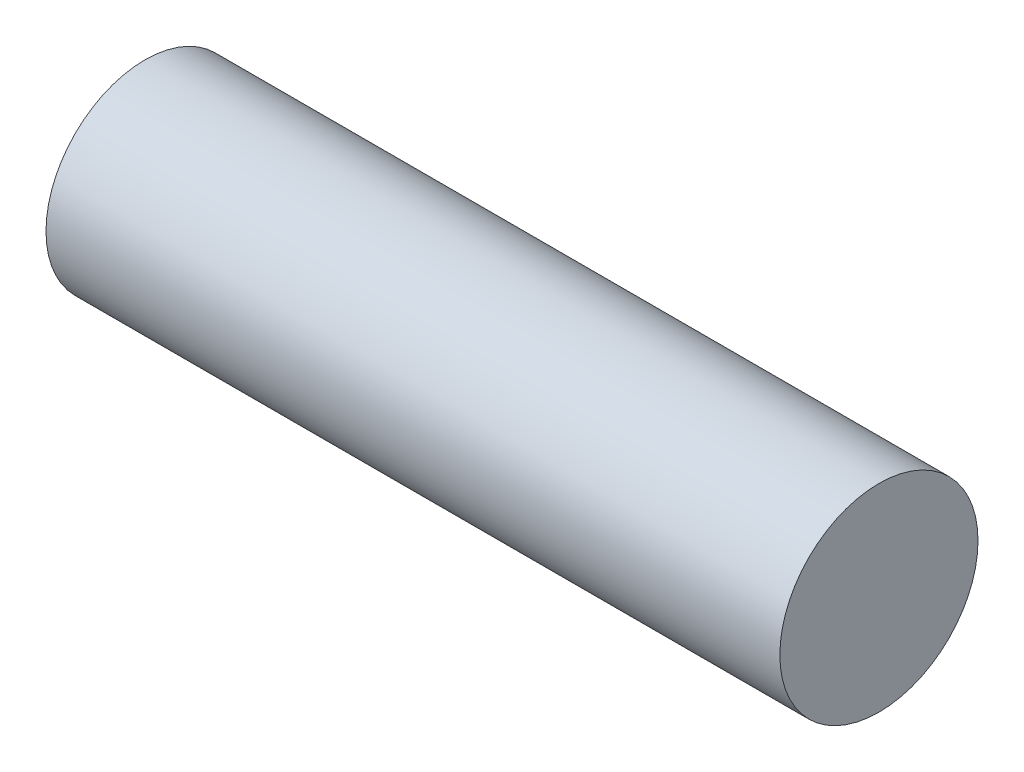
ISO-10303-21;
HEADER;
FILE_DESCRIPTION(('STEP AP214'),'2;1');
FILE_NAME('part.step','',(''),(''),'','','');
FILE_SCHEMA(('AUTOMOTIVE_DESIGN { 1 0 10303 214 1 1 1 1 }'));
ENDSEC;
DATA;
#1=APPLICATION_CONTEXT('core data for automotive mechanical design processes');
#2=APPLICATION_PROTOCOL_DEFINITION('international standard','automotive_design',2000,#1);
#3=PRODUCT_CONTEXT('',#1,'mechanical');
#4=PRODUCT('Part','Part','',(#3));
#5=PRODUCT_RELATED_PRODUCT_CATEGORY('part','',(#4));
#6=PRODUCT_DEFINITION_FORMATION('','',#4);
#7=PRODUCT_DEFINITION_CONTEXT('part definition',#1,'design');
#8=PRODUCT_DEFINITION('design','',#6,#7);
#9=PRODUCT_DEFINITION_SHAPE('','',#8);
#10=(LENGTH_UNIT() NAMED_UNIT(*) SI_UNIT(.MILLI.,.METRE.));
#11=(NAMED_UNIT(*) PLANE_ANGLE_UNIT() SI_UNIT($,.RADIAN.));
#12=(NAMED_UNIT(*) SI_UNIT($,.STERADIAN.) SOLID_ANGLE_UNIT());
#13=UNCERTAINTY_MEASURE_WITH_UNIT(LENGTH_MEASURE(1.E-05),#10,'distance_accuracy_value','');
#14=(GEOMETRIC_REPRESENTATION_CONTEXT(3) GLOBAL_UNCERTAINTY_ASSIGNED_CONTEXT((#13)) GLOBAL_UNIT_ASSIGNED_CONTEXT((#10,
#11,#12)) REPRESENTATION_CONTEXT('',''));
#15=CARTESIAN_POINT('',(0.,0.,0.));
#16=DIRECTION('',(0.,0.,1.));
#17=DIRECTION('',(1.,0.,0.));
#18=AXIS2_PLACEMENT_3D('',#15,#16,#17);
#19=CARTESIAN_POINT('',(50.,0.,0.));
#20=DIRECTION('',(-1.,0.,0.));
#21=DIRECTION('',(0.,0.,1.));
#22=AXIS2_PLACEMENT_3D('',#19,#20,#21);
#23=CYLINDRICAL_SURFACE('',#22,13.5);
#24=CARTESIAN_POINT('',(50.,0.,0.));
#25=DIRECTION('',(1.,0.,0.));
#26=DIRECTION('',(0.,0.,-1.));
#27=AXIS2_PLACEMENT_3D('',#24,#25,#26);
#28=CIRCLE('',#27,13.5);
#29=CARTESIAN_POINT('',(50.,0.,-13.5));
#30=VERTEX_POINT('',#29);
#31=EDGE_CURVE('E10',#30,#30,#28,.T.);
#32=ORIENTED_EDGE('',*,*,#31,.F.);
#33=EDGE_LOOP('',(#32));
#34=FACE_BOUND('',#33,.T.);
#35=CARTESIAN_POINT('',(-50.,0.,0.));
#36=DIRECTION('',(1.,0.,0.));
#37=DIRECTION('',(0.,0.,-1.));
#38=AXIS2_PLACEMENT_3D('',#35,#36,#37);
#39=CIRCLE('',#38,13.5);
#40=CARTESIAN_POINT('',(-50.,0.,-13.5));
#41=VERTEX_POINT('',#40);
#42=EDGE_CURVE('E46',#41,#41,#39,.T.);
#43=ORIENTED_EDGE('',*,*,#42,.T.);
#44=EDGE_LOOP('',(#43));
#45=FACE_BOUND('',#44,.T.);
#46=ADVANCED_FACE('F43',(#34,#45),#23,.T.);
#47=CARTESIAN_POINT('',(50.,0.,0.));
#48=DIRECTION('',(1.,0.,0.));
#49=DIRECTION('',(0.,0.,-1.));
#50=AXIS2_PLACEMENT_3D('',#47,#48,#49);
#51=PLANE('',#50);
#52=ORIENTED_EDGE('',*,*,#31,.T.);
#53=EDGE_LOOP('',(#52));
#54=FACE_BOUND('',#53,.T.);
#55=ADVANCED_FACE('F118',(#54),#51,.T.);
#56=CARTESIAN_POINT('',(-50.,0.,0.));
#57=DIRECTION('',(1.,0.,0.));
#58=DIRECTION('',(0.,0.,-1.));
#59=AXIS2_PLACEMENT_3D('',#56,#57,#58);
#60=PLANE('',#59);
#61=CARTESIAN_POINT('',(-50.,10.,0.));
#62=DIRECTION('',(-1.,0.,0.));
#63=DIRECTION('',(0.,0.,1.));
#64=AXIS2_PLACEMENT_3D('',#61,#62,#63);
#65=CIRCLE('',#64,1.25);
#66=CARTESIAN_POINT('',(-50.,10.,1.25));
#67=VERTEX_POINT('',#66);
#68=EDGE_CURVE('E90',#67,#67,#65,.T.);
#69=ORIENTED_EDGE('',*,*,#68,.F.);
#70=EDGE_LOOP('',(#69));
#71=FACE_BOUND('',#70,.T.);
#72=CARTESIAN_POINT('',(-50.,5.0000000000001,-8.66025403784433));
#73=DIRECTION('',(-1.,0.,0.));
#74=DIRECTION('',(0.,0.,1.));
#75=AXIS2_PLACEMENT_3D('',#72,#73,#74);
#76=CIRCLE('',#75,1.25);
#77=CARTESIAN_POINT('',(-50.,5.0000000000001,-7.41025403784433));
#78=VERTEX_POINT('',#77);
#79=EDGE_CURVE('E62',#78,#78,#76,.T.);
#80=ORIENTED_EDGE('',*,*,#79,.F.);
#81=EDGE_LOOP('',(#80));
#82=FACE_BOUND('',#81,.T.);
#83=CARTESIAN_POINT('',(-50.,-4.99999999999992,-8.66025403784443));
#84=DIRECTION('',(-1.,0.,0.));
#85=DIRECTION('',(0.,0.,1.));
#86=AXIS2_PLACEMENT_3D('',#83,#84,#85);
#87=CIRCLE('',#86,1.25);
#88=CARTESIAN_POINT('',(-50.,-4.99999999999992,-7.41025403784443));
#89=VERTEX_POINT('',#88);
#90=EDGE_CURVE('E61',#89,#89,#87,.T.);
#91=ORIENTED_EDGE('',*,*,#90,.F.);
#92=EDGE_LOOP('',(#91));
#93=FACE_BOUND('',#92,.T.);
#94=CARTESIAN_POINT('',(-50.,-10.,0.));
#95=DIRECTION('',(-1.,0.,0.));
#96=DIRECTION('',(0.,0.,1.));
#97=AXIS2_PLACEMENT_3D('',#94,#95,#96);
#98=CIRCLE('',#97,1.25);
#99=CARTESIAN_POINT('',(-50.,-10.,1.24999999999993));
#100=VERTEX_POINT('',#99);
#101=EDGE_CURVE('E70',#100,#100,#98,.T.);
#102=ORIENTED_EDGE('',*,*,#101,.F.);
#103=EDGE_LOOP('',(#102));
#104=FACE_BOUND('',#103,.T.);
#105=CARTESIAN_POINT('',(-50.,-5.00000000000004,8.66025403784437));
#106=DIRECTION('',(-1.,0.,0.));
#107=DIRECTION('',(0.,0.,1.));
#108=AXIS2_PLACEMENT_3D('',#105,#106,#107);
#109=CIRCLE('',#108,1.25);
#110=CARTESIAN_POINT('',(-50.,-5.00000000000004,9.91025403784437));
#111=VERTEX_POINT('',#110);
#112=EDGE_CURVE('E78',#111,#111,#109,.T.);
#113=ORIENTED_EDGE('',*,*,#112,.F.);
#114=EDGE_LOOP('',(#113));
#115=FACE_BOUND('',#114,.T.);
#116=CARTESIAN_POINT('',(-50.,4.99999999999998,8.6602540378444));
#117=DIRECTION('',(-1.,0.,0.));
#118=DIRECTION('',(0.,0.,1.));
#119=AXIS2_PLACEMENT_3D('',#116,#117,#118);
#120=CIRCLE('',#119,1.25);
#121=CARTESIAN_POINT('',(-50.,4.99999999999998,9.9102540378444));
#122=VERTEX_POINT('',#121);
#123=EDGE_CURVE('E86',#122,#122,#120,.T.);
#124=ORIENTED_EDGE('',*,*,#123,.F.);
#125=EDGE_LOOP('',(#124));
#126=FACE_BOUND('',#125,.T.);
#127=ORIENTED_EDGE('',*,*,#42,.F.);
#128=EDGE_LOOP('',(#127));
#129=FACE_BOUND('',#128,.T.);
#130=ADVANCED_FACE('F114',(#71,#82,#93,#104,#115,#126,#129),#60,.F.);
#131=CARTESIAN_POINT('',(-46.,4.99999999999998,8.6602540378444));
#132=DIRECTION('',(-1.,0.,0.));
#133=DIRECTION('',(0.,0.,1.));
#134=AXIS2_PLACEMENT_3D('',#131,#132,#133);
#135=CYLINDRICAL_SURFACE('',#134,1.25);
#136=CARTESIAN_POINT('',(-46.,4.99999999999998,8.6602540378444));
#137=DIRECTION('',(-1.,0.,0.));
#138=DIRECTION('',(0.,0.,1.));
#139=AXIS2_PLACEMENT_3D('',#136,#137,#138);
#140=CIRCLE('',#139,1.25);
#141=CARTESIAN_POINT('',(-46.,4.99999999999998,9.9102540378444));
#142=VERTEX_POINT('',#141);
#143=EDGE_CURVE('E82',#142,#142,#140,.T.);
#144=ORIENTED_EDGE('',*,*,#143,.F.);
#145=EDGE_LOOP('',(#144));
#146=FACE_BOUND('',#145,.T.);
#147=ORIENTED_EDGE('',*,*,#123,.T.);
#148=EDGE_LOOP('',(#147));
#149=FACE_BOUND('',#148,.T.);
#150=ADVANCED_FACE('F117',(#146,#149),#135,.F.);
#151=CARTESIAN_POINT('',(-46.,4.99999999999998,8.6602540378444));
#152=DIRECTION('',(-1.,0.,0.));
#153=DIRECTION('',(0.,0.,1.));
#154=AXIS2_PLACEMENT_3D('',#151,#152,#153);
#155=PLANE('',#154);
#156=ORIENTED_EDGE('',*,*,#143,.T.);
#157=EDGE_LOOP('',(#156));
#158=FACE_BOUND('',#157,.T.);
#159=ADVANCED_FACE('F164',(#158),#155,.T.);
#160=CARTESIAN_POINT('',(-46.,-5.00000000000004,8.66025403784437));
#161=DIRECTION('',(-1.,0.,0.));
#162=DIRECTION('',(0.,0.,1.));
#163=AXIS2_PLACEMENT_3D('',#160,#161,#162);
#164=CYLINDRICAL_SURFACE('',#163,1.25);
#165=CARTESIAN_POINT('',(-46.,-5.00000000000004,8.66025403784437));
#166=DIRECTION('',(-1.,0.,0.));
#167=DIRECTION('',(0.,0.,1.));
#168=AXIS2_PLACEMENT_3D('',#165,#166,#167);
#169=CIRCLE('',#168,1.25);
#170=CARTESIAN_POINT('',(-46.,-5.00000000000004,9.91025403784437));
#171=VERTEX_POINT('',#170);
#172=EDGE_CURVE('E74',#171,#171,#169,.T.);
#173=ORIENTED_EDGE('',*,*,#172,.F.);
#174=EDGE_LOOP('',(#173));
#175=FACE_BOUND('',#174,.T.);
#176=ORIENTED_EDGE('',*,*,#112,.T.);
#177=EDGE_LOOP('',(#176));
#178=FACE_BOUND('',#177,.T.);
#179=ADVANCED_FACE('F160',(#175,#178),#164,.F.);
#180=CARTESIAN_POINT('',(-46.,-5.00000000000004,8.66025403784437));
#181=DIRECTION('',(-1.,0.,0.));
#182=DIRECTION('',(0.,0.,1.));
#183=AXIS2_PLACEMENT_3D('',#180,#181,#182);
#184=PLANE('',#183);
#185=ORIENTED_EDGE('',*,*,#172,.T.);
#186=EDGE_LOOP('',(#185));
#187=FACE_BOUND('',#186,.T.);
#188=ADVANCED_FACE('F156',(#187),#184,.T.);
#189=CARTESIAN_POINT('',(-46.,-10.,0.));
#190=DIRECTION('',(-1.,0.,0.));
#191=DIRECTION('',(0.,0.,1.));
#192=AXIS2_PLACEMENT_3D('',#189,#190,#191);
#193=CYLINDRICAL_SURFACE('',#192,1.25);
#194=CARTESIAN_POINT('',(-46.,-10.,0.));
#195=DIRECTION('',(-1.,0.,0.));
#196=DIRECTION('',(0.,0.,1.));
#197=AXIS2_PLACEMENT_3D('',#194,#195,#196);
#198=CIRCLE('',#197,1.25);
#199=CARTESIAN_POINT('',(-46.,-10.,1.24999999999993));
#200=VERTEX_POINT('',#199);
#201=EDGE_CURVE('E66',#200,#200,#198,.T.);
#202=ORIENTED_EDGE('',*,*,#201,.F.);
#203=EDGE_LOOP('',(#202));
#204=FACE_BOUND('',#203,.T.);
#205=ORIENTED_EDGE('',*,*,#101,.T.);
#206=EDGE_LOOP('',(#205));
#207=FACE_BOUND('',#206,.T.);
#208=ADVANCED_FACE('F152',(#204,#207),#193,.F.);
#209=CARTESIAN_POINT('',(-46.,-10.,0.));
#210=DIRECTION('',(-1.,0.,0.));
#211=DIRECTION('',(0.,0.,1.));
#212=AXIS2_PLACEMENT_3D('',#209,#210,#211);
#213=PLANE('',#212);
#214=ORIENTED_EDGE('',*,*,#201,.T.);
#215=EDGE_LOOP('',(#214));
#216=FACE_BOUND('',#215,.T.);
#217=ADVANCED_FACE('F148',(#216),#213,.T.);
#218=CARTESIAN_POINT('',(-46.,-4.99999999999992,-8.66025403784443));
#219=DIRECTION('',(-1.,0.,0.));
#220=DIRECTION('',(0.,0.,1.));
#221=AXIS2_PLACEMENT_3D('',#218,#219,#220);
#222=CYLINDRICAL_SURFACE('',#221,1.25);
#223=CARTESIAN_POINT('',(-46.,-4.99999999999992,-8.66025403784443));
#224=DIRECTION('',(-1.,0.,0.));
#225=DIRECTION('',(0.,0.,1.));
#226=AXIS2_PLACEMENT_3D('',#223,#224,#225);
#227=CIRCLE('',#226,1.25);
#228=CARTESIAN_POINT('',(-46.,-4.99999999999992,-7.41025403784443));
#229=VERTEX_POINT('',#228);
#230=EDGE_CURVE('E57',#229,#229,#227,.T.);
#231=ORIENTED_EDGE('',*,*,#230,.F.);
#232=EDGE_LOOP('',(#231));
#233=FACE_BOUND('',#232,.T.);
#234=ORIENTED_EDGE('',*,*,#90,.T.);
#235=EDGE_LOOP('',(#234));
#236=FACE_BOUND('',#235,.T.);
#237=ADVANCED_FACE('F144',(#233,#236),#222,.F.);
#238=CARTESIAN_POINT('',(-46.,-4.99999999999992,-8.66025403784443));
#239=DIRECTION('',(-1.,0.,0.));
#240=DIRECTION('',(0.,0.,1.));
#241=AXIS2_PLACEMENT_3D('',#238,#239,#240);
#242=PLANE('',#241);
#243=ORIENTED_EDGE('',*,*,#230,.T.);
#244=EDGE_LOOP('',(#243));
#245=FACE_BOUND('',#244,.T.);
#246=ADVANCED_FACE('F140',(#245),#242,.T.);
#247=CARTESIAN_POINT('',(-46.,5.0000000000001,-8.66025403784433));
#248=DIRECTION('',(-1.,0.,0.));
#249=DIRECTION('',(0.,0.,1.));
#250=AXIS2_PLACEMENT_3D('',#247,#248,#249);
#251=CYLINDRICAL_SURFACE('',#250,1.25);
#252=CARTESIAN_POINT('',(-46.,5.0000000000001,-8.66025403784433));
#253=DIRECTION('',(-1.,0.,0.));
#254=DIRECTION('',(0.,0.,1.));
#255=AXIS2_PLACEMENT_3D('',#252,#253,#254);
#256=CIRCLE('',#255,1.25);
#257=CARTESIAN_POINT('',(-46.,5.0000000000001,-7.41025403784433));
#258=VERTEX_POINT('',#257);
#259=EDGE_CURVE('E91',#258,#258,#256,.T.);
#260=ORIENTED_EDGE('',*,*,#259,.F.);
#261=EDGE_LOOP('',(#260));
#262=FACE_BOUND('',#261,.T.);
#263=ORIENTED_EDGE('',*,*,#79,.T.);
#264=EDGE_LOOP('',(#263));
#265=FACE_BOUND('',#264,.T.);
#266=ADVANCED_FACE('F143',(#262,#265),#251,.F.);
#267=CARTESIAN_POINT('',(-46.,5.0000000000001,-8.66025403784433));
#268=DIRECTION('',(-1.,0.,0.));
#269=DIRECTION('',(0.,0.,1.));
#270=AXIS2_PLACEMENT_3D('',#267,#268,#269);
#271=PLANE('',#270);
#272=ORIENTED_EDGE('',*,*,#259,.T.);
#273=EDGE_LOOP('',(#272));
#274=FACE_BOUND('',#273,.T.);
#275=ADVANCED_FACE('F110',(#274),#271,.T.);
#276=CARTESIAN_POINT('',(-46.,10.,0.));
#277=DIRECTION('',(-1.,0.,0.));
#278=DIRECTION('',(0.,0.,1.));
#279=AXIS2_PLACEMENT_3D('',#276,#277,#278);
#280=CYLINDRICAL_SURFACE('',#279,1.25);
#281=CARTESIAN_POINT('',(-46.,10.,0.));
#282=DIRECTION('',(-1.,0.,0.));
#283=DIRECTION('',(0.,0.,1.));
#284=AXIS2_PLACEMENT_3D('',#281,#282,#283);
#285=CIRCLE('',#284,1.25);
#286=CARTESIAN_POINT('',(-46.,10.,1.25));
#287=VERTEX_POINT('',#286);
#288=EDGE_CURVE('E55',#287,#287,#285,.T.);
#289=ORIENTED_EDGE('',*,*,#288,.F.);
#290=EDGE_LOOP('',(#289));
#291=FACE_BOUND('',#290,.T.);
#292=ORIENTED_EDGE('',*,*,#68,.T.);
#293=EDGE_LOOP('',(#292));
#294=FACE_BOUND('',#293,.T.);
#295=ADVANCED_FACE('F107',(#291,#294),#280,.F.);
#296=CARTESIAN_POINT('',(-46.,10.,0.));
#297=DIRECTION('',(-1.,0.,0.));
#298=DIRECTION('',(0.,0.,1.));
#299=AXIS2_PLACEMENT_3D('',#296,#297,#298);
#300=PLANE('',#299);
#301=ORIENTED_EDGE('',*,*,#288,.T.);
#302=EDGE_LOOP('',(#301));
#303=FACE_BOUND('',#302,.T.);
#304=ADVANCED_FACE('F105',(#303),#300,.T.);
#305=CLOSED_SHELL('',(#46,#55,#130,#150,#159,#179,#188,#208,#217,#237,#246,#266,#275,#295,#304));
#306=MANIFOLD_SOLID_BREP('B2',#305);
#307=ADVANCED_BREP_SHAPE_REPRESENTATION('',(#18,#306),#14);
#308=SHAPE_DEFINITION_REPRESENTATION(#9,#307);
ENDSEC;
END-ISO-10303-21;
